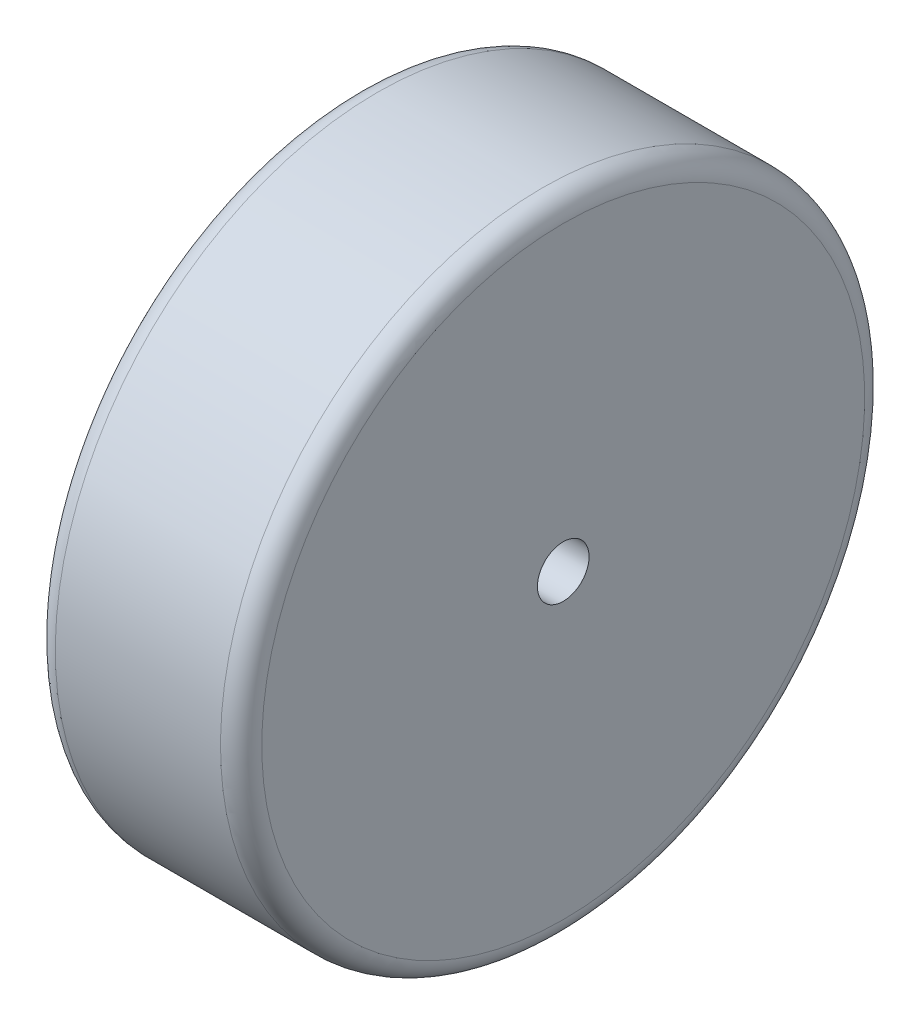
ISO-10303-21;
HEADER;
FILE_DESCRIPTION(('STEP AP214'),'2;1');
FILE_NAME('part.step','',(''),(''),'','','');
FILE_SCHEMA(('AUTOMOTIVE_DESIGN { 1 0 10303 214 1 1 1 1 }'));
ENDSEC;
DATA;
#1=APPLICATION_CONTEXT('core data for automotive mechanical design processes');
#2=APPLICATION_PROTOCOL_DEFINITION('international standard','automotive_design',2000,#1);
#3=PRODUCT_CONTEXT('',#1,'mechanical');
#4=PRODUCT('Part','Part','',(#3));
#5=PRODUCT_RELATED_PRODUCT_CATEGORY('part','',(#4));
#6=PRODUCT_DEFINITION_FORMATION('','',#4);
#7=PRODUCT_DEFINITION_CONTEXT('part definition',#1,'design');
#8=PRODUCT_DEFINITION('design','',#6,#7);
#9=PRODUCT_DEFINITION_SHAPE('','',#8);
#10=(LENGTH_UNIT() NAMED_UNIT(*) SI_UNIT(.MILLI.,.METRE.));
#11=(NAMED_UNIT(*) PLANE_ANGLE_UNIT() SI_UNIT($,.RADIAN.));
#12=(NAMED_UNIT(*) SI_UNIT($,.STERADIAN.) SOLID_ANGLE_UNIT());
#13=UNCERTAINTY_MEASURE_WITH_UNIT(LENGTH_MEASURE(1.E-05),#10,'distance_accuracy_value','');
#14=(GEOMETRIC_REPRESENTATION_CONTEXT(3) GLOBAL_UNCERTAINTY_ASSIGNED_CONTEXT((#13)) GLOBAL_UNIT_ASSIGNED_CONTEXT((#10,
#11,#12)) REPRESENTATION_CONTEXT('',''));
#15=CARTESIAN_POINT('',(0.,0.,0.));
#16=DIRECTION('',(0.,0.,1.));
#17=DIRECTION('',(1.,0.,0.));
#18=AXIS2_PLACEMENT_3D('',#15,#16,#17);
#19=CARTESIAN_POINT('',(18.,0.,0.));
#20=DIRECTION('',(1.,0.,0.));
#21=DIRECTION('',(0.,1.,0.));
#22=AXIS2_PLACEMENT_3D('',#19,#20,#21);
#23=TOROIDAL_SURFACE('',#22,29.2,2.);
#24=CARTESIAN_POINT('',(20.,0.,0.));
#25=DIRECTION('',(1.,0.,0.));
#26=DIRECTION('',(0.,1.,0.));
#27=AXIS2_PLACEMENT_3D('',#24,#25,#26);
#28=CIRCLE('',#27,29.2);
#29=CARTESIAN_POINT('',(20.,29.2,0.));
#30=VERTEX_POINT('',#29);
#31=EDGE_CURVE('E57',#30,#30,#28,.T.);
#32=ORIENTED_EDGE('',*,*,#31,.F.);
#33=EDGE_LOOP('',(#32));
#34=FACE_BOUND('',#33,.T.);
#35=CARTESIAN_POINT('',(18.,0.,0.));
#36=DIRECTION('',(-1.,0.,0.));
#37=DIRECTION('',(0.,1.,0.));
#38=AXIS2_PLACEMENT_3D('',#35,#36,#37);
#39=CIRCLE('',#38,31.2);
#40=CARTESIAN_POINT('',(18.,31.2,0.));
#41=VERTEX_POINT('',#40);
#42=EDGE_CURVE('E10',#41,#41,#39,.T.);
#43=ORIENTED_EDGE('',*,*,#42,.F.);
#44=EDGE_LOOP('',(#43));
#45=FACE_BOUND('',#44,.T.);
#46=ADVANCED_FACE('F16',(#34,#45),#23,.T.);
#47=CARTESIAN_POINT('',(2.,0.,0.));
#48=DIRECTION('',(1.,0.,0.));
#49=DIRECTION('',(0.,1.,0.));
#50=AXIS2_PLACEMENT_3D('',#47,#48,#49);
#51=TOROIDAL_SURFACE('',#50,29.2,2.);
#52=CARTESIAN_POINT('',(2.,0.,0.));
#53=DIRECTION('',(1.,0.,0.));
#54=DIRECTION('',(0.,1.,0.));
#55=AXIS2_PLACEMENT_3D('',#52,#53,#54);
#56=CIRCLE('',#55,31.2);
#57=CARTESIAN_POINT('',(2.,31.2,0.));
#58=VERTEX_POINT('',#57);
#59=EDGE_CURVE('E24',#58,#58,#56,.T.);
#60=ORIENTED_EDGE('',*,*,#59,.F.);
#61=EDGE_LOOP('',(#60));
#62=FACE_BOUND('',#61,.T.);
#63=CARTESIAN_POINT('',(0.,0.,0.));
#64=DIRECTION('',(-1.,0.,0.));
#65=DIRECTION('',(0.,1.,0.));
#66=AXIS2_PLACEMENT_3D('',#63,#64,#65);
#67=CIRCLE('',#66,29.2);
#68=CARTESIAN_POINT('',(0.,29.2,0.));
#69=VERTEX_POINT('',#68);
#70=EDGE_CURVE('E67',#69,#69,#67,.T.);
#71=ORIENTED_EDGE('',*,*,#70,.F.);
#72=EDGE_LOOP('',(#71));
#73=FACE_BOUND('',#72,.T.);
#74=ADVANCED_FACE('F99',(#62,#73),#51,.T.);
#75=CARTESIAN_POINT('',(20.,0.,0.));
#76=DIRECTION('',(-1.,0.,0.));
#77=DIRECTION('',(0.,-1.,0.));
#78=AXIS2_PLACEMENT_3D('',#75,#76,#77);
#79=CYLINDRICAL_SURFACE('',#78,2.5);
#80=CARTESIAN_POINT('',(0.,0.,0.));
#81=DIRECTION('',(1.,0.,0.));
#82=DIRECTION('',(0.,1.,0.));
#83=AXIS2_PLACEMENT_3D('',#80,#81,#82);
#84=CIRCLE('',#83,2.5);
#85=CARTESIAN_POINT('',(0.,2.5,0.));
#86=VERTEX_POINT('',#85);
#87=EDGE_CURVE('E72',#86,#86,#84,.T.);
#88=ORIENTED_EDGE('',*,*,#87,.F.);
#89=EDGE_LOOP('',(#88));
#90=FACE_BOUND('',#89,.T.);
#91=CARTESIAN_POINT('',(20.,0.,0.));
#92=DIRECTION('',(1.,0.,0.));
#93=DIRECTION('',(0.,1.,0.));
#94=AXIS2_PLACEMENT_3D('',#91,#92,#93);
#95=CIRCLE('',#94,2.5);
#96=CARTESIAN_POINT('',(20.,2.5,0.));
#97=VERTEX_POINT('',#96);
#98=EDGE_CURVE('E61',#97,#97,#95,.T.);
#99=ORIENTED_EDGE('',*,*,#98,.T.);
#100=EDGE_LOOP('',(#99));
#101=FACE_BOUND('',#100,.T.);
#102=ADVANCED_FACE('F106',(#90,#101),#79,.F.);
#103=CARTESIAN_POINT('',(20.,0.,0.));
#104=DIRECTION('',(-1.,0.,0.));
#105=DIRECTION('',(0.,-1.,0.));
#106=AXIS2_PLACEMENT_3D('',#103,#104,#105);
#107=CYLINDRICAL_SURFACE('',#106,31.2);
#108=ORIENTED_EDGE('',*,*,#42,.T.);
#109=EDGE_LOOP('',(#108));
#110=FACE_BOUND('',#109,.T.);
#111=ORIENTED_EDGE('',*,*,#59,.T.);
#112=EDGE_LOOP('',(#111));
#113=FACE_BOUND('',#112,.T.);
#114=ADVANCED_FACE('F114',(#110,#113),#107,.T.);
#115=CARTESIAN_POINT('',(0.,0.,0.));
#116=DIRECTION('',(1.,0.,0.));
#117=DIRECTION('',(0.,1.,0.));
#118=AXIS2_PLACEMENT_3D('',#115,#116,#117);
#119=PLANE('',#118);
#120=ORIENTED_EDGE('',*,*,#87,.T.);
#121=EDGE_LOOP('',(#120));
#122=FACE_BOUND('',#121,.T.);
#123=ORIENTED_EDGE('',*,*,#70,.T.);
#124=EDGE_LOOP('',(#123));
#125=FACE_BOUND('',#124,.T.);
#126=ADVANCED_FACE('F123',(#122,#125),#119,.F.);
#127=CARTESIAN_POINT('',(20.,0.,0.));
#128=DIRECTION('',(1.,0.,0.));
#129=DIRECTION('',(0.,1.,0.));
#130=AXIS2_PLACEMENT_3D('',#127,#128,#129);
#131=PLANE('',#130);
#132=ORIENTED_EDGE('',*,*,#98,.F.);
#133=EDGE_LOOP('',(#132));
#134=FACE_BOUND('',#133,.T.);
#135=ORIENTED_EDGE('',*,*,#31,.T.);
#136=EDGE_LOOP('',(#135));
#137=FACE_BOUND('',#136,.T.);
#138=ADVANCED_FACE('F58',(#134,#137),#131,.T.);
#139=CLOSED_SHELL('',(#46,#74,#102,#114,#126,#138));
#140=MANIFOLD_SOLID_BREP('B1',#139);
#141=ADVANCED_BREP_SHAPE_REPRESENTATION('',(#18,#140),#14);
#142=SHAPE_DEFINITION_REPRESENTATION(#9,#141);
ENDSEC;
END-ISO-10303-21;
